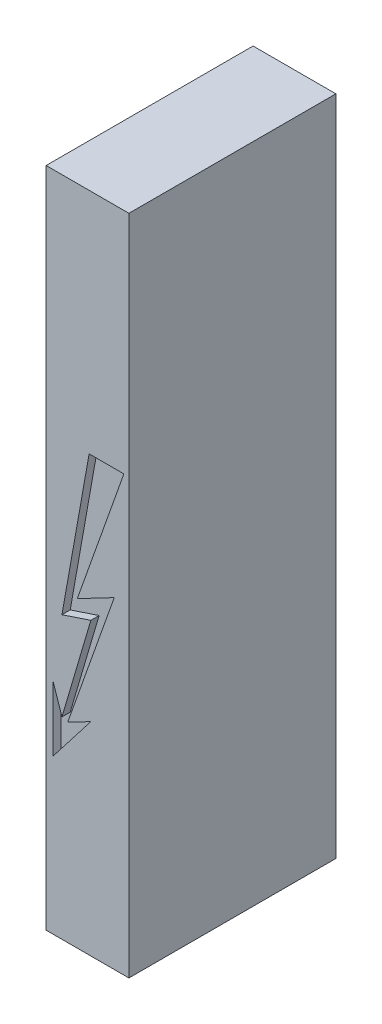
ISO-10303-21;
HEADER;
FILE_DESCRIPTION(('STEP AP214'),'2;1');
FILE_NAME('part.step','',(''),(''),'','','');
FILE_SCHEMA(('AUTOMOTIVE_DESIGN { 1 0 10303 214 1 1 1 1 }'));
ENDSEC;
DATA;
#1=APPLICATION_CONTEXT('core data for automotive mechanical design processes');
#2=APPLICATION_PROTOCOL_DEFINITION('international standard','automotive_design',2000,#1);
#3=PRODUCT_CONTEXT('',#1,'mechanical');
#4=PRODUCT('Part','Part','',(#3));
#5=PRODUCT_RELATED_PRODUCT_CATEGORY('part','',(#4));
#6=PRODUCT_DEFINITION_FORMATION('','',#4);
#7=PRODUCT_DEFINITION_CONTEXT('part definition',#1,'design');
#8=PRODUCT_DEFINITION('design','',#6,#7);
#9=PRODUCT_DEFINITION_SHAPE('','',#8);
#10=(LENGTH_UNIT() NAMED_UNIT(*) SI_UNIT(.MILLI.,.METRE.));
#11=(NAMED_UNIT(*) PLANE_ANGLE_UNIT() SI_UNIT($,.RADIAN.));
#12=(NAMED_UNIT(*) SI_UNIT($,.STERADIAN.) SOLID_ANGLE_UNIT());
#13=UNCERTAINTY_MEASURE_WITH_UNIT(LENGTH_MEASURE(1.E-05),#10,'distance_accuracy_value','');
#14=(GEOMETRIC_REPRESENTATION_CONTEXT(3) GLOBAL_UNCERTAINTY_ASSIGNED_CONTEXT((#13)) GLOBAL_UNIT_ASSIGNED_CONTEXT((#10,
#11,#12)) REPRESENTATION_CONTEXT('',''));
#15=CARTESIAN_POINT('',(0.,0.,0.));
#16=DIRECTION('',(0.,0.,1.));
#17=DIRECTION('',(1.,0.,0.));
#18=AXIS2_PLACEMENT_3D('',#15,#16,#17);
#19=CARTESIAN_POINT('',(-5.,-40.,12.5));
#20=DIRECTION('',(1.,0.,0.));
#21=DIRECTION('',(0.,0.,-1.));
#22=AXIS2_PLACEMENT_3D('',#19,#20,#21);
#23=PLANE('',#22);
#24=DIRECTION('',(0.,-1.,0.));
#25=VECTOR('',#24,1.);
#26=CARTESIAN_POINT('',(-5.,-40.,-12.5));
#27=LINE('',#26,#25);
#28=CARTESIAN_POINT('',(-5.,40.,-12.5));
#29=VERTEX_POINT('',#28);
#30=CARTESIAN_POINT('',(-5.,-40.,-12.5));
#31=VERTEX_POINT('',#30);
#32=EDGE_CURVE('E228',#29,#31,#27,.T.);
#33=ORIENTED_EDGE('',*,*,#32,.T.);
#34=DIRECTION('',(0.,0.,-1.));
#35=VECTOR('',#34,1.);
#36=CARTESIAN_POINT('',(-5.,-40.,12.5));
#37=LINE('',#36,#35);
#38=CARTESIAN_POINT('',(-5.,-40.,12.5));
#39=VERTEX_POINT('',#38);
#40=EDGE_CURVE('E11',#39,#31,#37,.T.);
#41=ORIENTED_EDGE('',*,*,#40,.F.);
#42=DIRECTION('',(0.,-1.,0.));
#43=VECTOR('',#42,1.);
#44=CARTESIAN_POINT('',(-5.,-40.,12.5));
#45=LINE('',#44,#43);
#46=CARTESIAN_POINT('',(-5.,40.,12.5));
#47=VERTEX_POINT('',#46);
#48=EDGE_CURVE('E246',#47,#39,#45,.T.);
#49=ORIENTED_EDGE('',*,*,#48,.F.);
#50=DIRECTION('',(0.,0.,-1.));
#51=VECTOR('',#50,1.);
#52=CARTESIAN_POINT('',(-5.,40.,12.5));
#53=LINE('',#52,#51);
#54=EDGE_CURVE('E252',#47,#29,#53,.T.);
#55=ORIENTED_EDGE('',*,*,#54,.T.);
#56=EDGE_LOOP('',(#33,#41,#49,#55));
#57=FACE_BOUND('',#56,.T.);
#58=ADVANCED_FACE('F36',(#57),#23,.F.);
#59=CARTESIAN_POINT('',(5.,-40.,12.5));
#60=DIRECTION('',(0.,1.,0.));
#61=DIRECTION('',(0.,0.,1.));
#62=AXIS2_PLACEMENT_3D('',#59,#60,#61);
#63=PLANE('',#62);
#64=DIRECTION('',(1.,0.,0.));
#65=VECTOR('',#64,1.);
#66=CARTESIAN_POINT('',(5.,-40.,-12.5));
#67=LINE('',#66,#65);
#68=CARTESIAN_POINT('',(5.,-40.,-12.5));
#69=VERTEX_POINT('',#68);
#70=EDGE_CURVE('E255',#31,#69,#67,.T.);
#71=ORIENTED_EDGE('',*,*,#70,.T.);
#72=DIRECTION('',(0.,0.,-1.));
#73=VECTOR('',#72,1.);
#74=CARTESIAN_POINT('',(5.,-40.,12.5));
#75=LINE('',#74,#73);
#76=CARTESIAN_POINT('',(5.,-40.,12.5));
#77=VERTEX_POINT('',#76);
#78=EDGE_CURVE('E43',#77,#69,#75,.T.);
#79=ORIENTED_EDGE('',*,*,#78,.F.);
#80=DIRECTION('',(1.,0.,0.));
#81=VECTOR('',#80,1.);
#82=CARTESIAN_POINT('',(5.,-40.,12.5));
#83=LINE('',#82,#81);
#84=EDGE_CURVE('E87',#39,#77,#83,.T.);
#85=ORIENTED_EDGE('',*,*,#84,.F.);
#86=ORIENTED_EDGE('',*,*,#40,.T.);
#87=EDGE_LOOP('',(#71,#79,#85,#86));
#88=FACE_BOUND('',#87,.T.);
#89=ADVANCED_FACE('F284',(#88),#63,.F.);
#90=CARTESIAN_POINT('',(5.,-40.,12.5));
#91=DIRECTION('',(-1.,0.,0.));
#92=DIRECTION('',(0.,0.,1.));
#93=AXIS2_PLACEMENT_3D('',#90,#91,#92);
#94=PLANE('',#93);
#95=DIRECTION('',(0.,1.,0.));
#96=VECTOR('',#95,1.);
#97=CARTESIAN_POINT('',(5.,-40.,-12.5));
#98=LINE('',#97,#96);
#99=CARTESIAN_POINT('',(5.,40.,-12.5));
#100=VERTEX_POINT('',#99);
#101=EDGE_CURVE('E257',#69,#100,#98,.T.);
#102=ORIENTED_EDGE('',*,*,#101,.T.);
#103=DIRECTION('',(0.,0.,-1.));
#104=VECTOR('',#103,1.);
#105=CARTESIAN_POINT('',(5.,40.,12.5));
#106=LINE('',#105,#104);
#107=CARTESIAN_POINT('',(5.,40.,12.5));
#108=VERTEX_POINT('',#107);
#109=EDGE_CURVE('E261',#108,#100,#106,.T.);
#110=ORIENTED_EDGE('',*,*,#109,.F.);
#111=DIRECTION('',(0.,1.,0.));
#112=VECTOR('',#111,1.);
#113=CARTESIAN_POINT('',(5.,-40.,12.5));
#114=LINE('',#113,#112);
#115=EDGE_CURVE('E249',#77,#108,#114,.T.);
#116=ORIENTED_EDGE('',*,*,#115,.F.);
#117=ORIENTED_EDGE('',*,*,#78,.T.);
#118=EDGE_LOOP('',(#102,#110,#116,#117));
#119=FACE_BOUND('',#118,.T.);
#120=ADVANCED_FACE('F266',(#119),#94,.F.);
#121=CARTESIAN_POINT('',(5.,40.,12.5));
#122=DIRECTION('',(0.,-1.,0.));
#123=DIRECTION('',(1.,0.,0.));
#124=AXIS2_PLACEMENT_3D('',#121,#122,#123);
#125=PLANE('',#124);
#126=DIRECTION('',(-1.,0.,0.));
#127=VECTOR('',#126,1.);
#128=CARTESIAN_POINT('',(5.,40.,-12.5));
#129=LINE('',#128,#127);
#130=EDGE_CURVE('E80',#100,#29,#129,.T.);
#131=ORIENTED_EDGE('',*,*,#130,.T.);
#132=ORIENTED_EDGE('',*,*,#54,.F.);
#133=DIRECTION('',(-1.,0.,0.));
#134=VECTOR('',#133,1.);
#135=CARTESIAN_POINT('',(5.,40.,12.5));
#136=LINE('',#135,#134);
#137=EDGE_CURVE('E59',#108,#47,#136,.T.);
#138=ORIENTED_EDGE('',*,*,#137,.F.);
#139=ORIENTED_EDGE('',*,*,#109,.T.);
#140=EDGE_LOOP('',(#131,#132,#138,#139));
#141=FACE_BOUND('',#140,.T.);
#142=ADVANCED_FACE('F274',(#141),#125,.F.);
#143=CARTESIAN_POINT('',(0.,0.,12.5));
#144=DIRECTION('',(0.,0.,1.));
#145=DIRECTION('',(1.,0.,0.));
#146=AXIS2_PLACEMENT_3D('',#143,#144,#145);
#147=PLANE('',#146);
#148=DIRECTION('',(0.334377178520095,0.942439336235994,0.));
#149=VECTOR('',#148,1.);
#150=CARTESIAN_POINT('',(-1.23803225223413,-3.43125061005469,12.5));
#151=LINE('',#150,#149);
#152=CARTESIAN_POINT('',(-1.23803225223413,-3.43125061005469,12.5));
#153=VERTEX_POINT('',#152);
#154=CARTESIAN_POINT('',(4.38989294329531,12.4310104124686,12.5));
#155=VERTEX_POINT('',#154);
#156=EDGE_CURVE('E50',#153,#155,#151,.T.);
#157=ORIENTED_EDGE('',*,*,#156,.F.);
#158=DIRECTION('',(-0.885968643465612,-0.46374514854142,0.));
#159=VECTOR('',#158,1.);
#160=CARTESIAN_POINT('',(3.22694529873063,-1.09413440071942,12.5));
#161=LINE('',#160,#159);
#162=CARTESIAN_POINT('',(3.22694529873063,-1.09413440071942,12.5));
#163=VERTEX_POINT('',#162);
#164=EDGE_CURVE('E172',#163,#153,#161,.T.);
#165=ORIENTED_EDGE('',*,*,#164,.F.);
#166=DIRECTION('',(0.334377178520095,0.942439336235994,0.));
#167=VECTOR('',#166,1.);
#168=CARTESIAN_POINT('',(-2.395490823155,-16.9409245141803,12.5));
#169=LINE('',#168,#167);
#170=CARTESIAN_POINT('',(-2.395490823155,-16.9409245141803,12.5));
#171=VERTEX_POINT('',#170);
#172=EDGE_CURVE('E175',#171,#163,#169,.T.);
#173=ORIENTED_EDGE('',*,*,#172,.F.);
#174=DIRECTION('',(-0.885968643465612,-0.46374514854142,0.));
#175=VECTOR('',#174,1.);
#176=CARTESIAN_POINT('',(0.403107322714153,-15.4760461322692,12.5));
#177=LINE('',#176,#175);
#178=CARTESIAN_POINT('',(0.403107322714153,-15.4760461322692,12.5));
#179=VERTEX_POINT('',#178);
#180=EDGE_CURVE('E221',#179,#171,#177,.T.);
#181=ORIENTED_EDGE('',*,*,#180,.F.);
#182=DIRECTION('',(0.612303075014751,0.790623136726646,0.));
#183=VECTOR('',#182,1.);
#184=CARTESIAN_POINT('',(-4.19416945297008,-21.4121805942829,12.5));
#185=LINE('',#184,#183);
#186=CARTESIAN_POINT('',(-4.19416945297008,-21.4121805942829,12.5));
#187=VERTEX_POINT('',#186);
#188=EDGE_CURVE('E218',#187,#179,#185,.T.);
#189=ORIENTED_EDGE('',*,*,#188,.F.);
#190=DIRECTION('',(0.,-1.,0.));
#191=VECTOR('',#190,1.);
#192=CARTESIAN_POINT('',(-4.19416945297008,-13.4263047640388,12.5));
#193=LINE('',#192,#191);
#194=CARTESIAN_POINT('',(-4.19416945297008,-13.4263047640388,12.5));
#195=VERTEX_POINT('',#194);
#196=EDGE_CURVE('E215',#195,#187,#193,.T.);
#197=ORIENTED_EDGE('',*,*,#196,.F.);
#198=DIRECTION('',(-0.31622776601684,0.948683298050513,0.));
#199=VECTOR('',#198,1.);
#200=CARTESIAN_POINT('',(-3.09093177233658,-16.7360178059393,12.5));
#201=LINE('',#200,#199);
#202=CARTESIAN_POINT('',(-3.09093177233658,-16.7360178059393,12.5));
#203=VERTEX_POINT('',#202);
#204=EDGE_CURVE('E212',#203,#195,#201,.T.);
#205=ORIENTED_EDGE('',*,*,#204,.F.);
#206=DIRECTION('',(-0.282629976577567,-0.959229011414774,0.));
#207=VECTOR('',#206,1.);
#208=CARTESIAN_POINT('',(0.403107322713769,-4.87746087728354,12.5));
#209=LINE('',#208,#207);
#210=CARTESIAN_POINT('',(0.403107322713769,-4.87746087728354,12.5));
#211=VERTEX_POINT('',#210);
#212=EDGE_CURVE('E209',#211,#203,#209,.T.);
#213=ORIENTED_EDGE('',*,*,#212,.F.);
#214=DIRECTION('',(0.948683298050513,0.31622776601684,0.));
#215=VECTOR('',#214,1.);
#216=CARTESIAN_POINT('',(-3.09093177233659,-6.04214057563367,12.5));
#217=LINE('',#216,#215);
#218=CARTESIAN_POINT('',(-3.09093177233659,-6.04214057563367,12.5));
#219=VERTEX_POINT('',#218);
#220=EDGE_CURVE('E206',#219,#211,#217,.T.);
#221=ORIENTED_EDGE('',*,*,#220,.F.);
#222=DIRECTION('',(-0.175033334717494,-0.984562507785907,0.));
#223=VECTOR('',#222,1.);
#224=CARTESIAN_POINT('',(0.193183958881578,12.4310104124686,12.5));
#225=LINE('',#224,#223);
#226=CARTESIAN_POINT('',(0.193183958881578,12.4310104124686,12.5));
#227=VERTEX_POINT('',#226);
#228=EDGE_CURVE('E203',#227,#219,#225,.T.);
#229=ORIENTED_EDGE('',*,*,#228,.F.);
#230=DIRECTION('',(-1.,0.,0.));
#231=VECTOR('',#230,1.);
#232=CARTESIAN_POINT('',(4.38989294329531,12.4310104124686,12.5));
#233=LINE('',#232,#231);
#234=EDGE_CURVE('E201',#155,#227,#233,.T.);
#235=ORIENTED_EDGE('',*,*,#234,.F.);
#236=EDGE_LOOP('',(#157,#165,#173,#181,#189,#197,#205,#213,#221,#229,#235));
#237=FACE_BOUND('',#236,.T.);
#238=ORIENTED_EDGE('',*,*,#48,.T.);
#239=ORIENTED_EDGE('',*,*,#84,.T.);
#240=ORIENTED_EDGE('',*,*,#115,.T.);
#241=ORIENTED_EDGE('',*,*,#137,.T.);
#242=EDGE_LOOP('',(#238,#239,#240,#241));
#243=FACE_BOUND('',#242,.T.);
#244=ADVANCED_FACE('F276',(#237,#243),#147,.T.);
#245=CARTESIAN_POINT('',(0.,0.,-12.5));
#246=DIRECTION('',(0.,0.,1.));
#247=DIRECTION('',(1.,0.,0.));
#248=AXIS2_PLACEMENT_3D('',#245,#246,#247);
#249=PLANE('',#248);
#250=ORIENTED_EDGE('',*,*,#32,.F.);
#251=ORIENTED_EDGE('',*,*,#130,.F.);
#252=ORIENTED_EDGE('',*,*,#101,.F.);
#253=ORIENTED_EDGE('',*,*,#70,.F.);
#254=EDGE_LOOP('',(#250,#251,#252,#253));
#255=FACE_BOUND('',#254,.T.);
#256=ADVANCED_FACE('F270',(#255),#249,.F.);
#257=CARTESIAN_POINT('',(-1.23803225223413,-3.43125061005469,11.5));
#258=DIRECTION('',(0.942439336235994,-0.334377178520095,0.));
#259=DIRECTION('',(0.334377178520095,0.942439336235994,0.));
#260=AXIS2_PLACEMENT_3D('',#257,#258,#259);
#261=PLANE('',#260);
#262=ORIENTED_EDGE('',*,*,#156,.T.);
#263=DIRECTION('',(0.,0.,1.));
#264=VECTOR('',#263,1.);
#265=CARTESIAN_POINT('',(4.38989294329531,12.4310104124686,11.5));
#266=LINE('',#265,#264);
#267=CARTESIAN_POINT('',(4.38989294329531,12.4310104124686,11.5));
#268=VERTEX_POINT('',#267);
#269=EDGE_CURVE('E149',#268,#155,#266,.T.);
#270=ORIENTED_EDGE('',*,*,#269,.F.);
#271=DIRECTION('',(0.334377178520095,0.942439336235994,0.));
#272=VECTOR('',#271,1.);
#273=CARTESIAN_POINT('',(-1.23803225223413,-3.43125061005469,11.5));
#274=LINE('',#273,#272);
#275=CARTESIAN_POINT('',(-1.23803225223413,-3.43125061005469,11.5));
#276=VERTEX_POINT('',#275);
#277=EDGE_CURVE('E153',#276,#268,#274,.T.);
#278=ORIENTED_EDGE('',*,*,#277,.F.);
#279=DIRECTION('',(0.,0.,1.));
#280=VECTOR('',#279,1.);
#281=CARTESIAN_POINT('',(-1.23803225223413,-3.43125061005469,11.5));
#282=LINE('',#281,#280);
#283=EDGE_CURVE('E226',#276,#153,#282,.T.);
#284=ORIENTED_EDGE('',*,*,#283,.T.);
#285=EDGE_LOOP('',(#262,#270,#278,#284));
#286=FACE_BOUND('',#285,.T.);
#287=ADVANCED_FACE('F151',(#286),#261,.F.);
#288=CARTESIAN_POINT('',(3.22694529873063,-1.09413440071942,11.5));
#289=DIRECTION('',(-0.46374514854142,0.885968643465612,0.));
#290=DIRECTION('',(-0.885968643465612,-0.46374514854142,0.));
#291=AXIS2_PLACEMENT_3D('',#288,#289,#290);
#292=PLANE('',#291);
#293=ORIENTED_EDGE('',*,*,#164,.T.);
#294=ORIENTED_EDGE('',*,*,#283,.F.);
#295=DIRECTION('',(-0.885968643465612,-0.46374514854142,0.));
#296=VECTOR('',#295,1.);
#297=CARTESIAN_POINT('',(3.22694529873063,-1.09413440071942,11.5));
#298=LINE('',#297,#296);
#299=CARTESIAN_POINT('',(3.22694529873063,-1.09413440071942,11.5));
#300=VERTEX_POINT('',#299);
#301=EDGE_CURVE('E159',#300,#276,#298,.T.);
#302=ORIENTED_EDGE('',*,*,#301,.F.);
#303=DIRECTION('',(0.,0.,1.));
#304=VECTOR('',#303,1.);
#305=CARTESIAN_POINT('',(3.22694529873063,-1.09413440071942,11.5));
#306=LINE('',#305,#304);
#307=EDGE_CURVE('E229',#300,#163,#306,.T.);
#308=ORIENTED_EDGE('',*,*,#307,.T.);
#309=EDGE_LOOP('',(#293,#294,#302,#308));
#310=FACE_BOUND('',#309,.T.);
#311=ADVANCED_FACE('F323',(#310),#292,.F.);
#312=CARTESIAN_POINT('',(-2.395490823155,-16.9409245141803,11.5));
#313=DIRECTION('',(0.942439336235994,-0.334377178520095,0.));
#314=DIRECTION('',(0.334377178520095,0.942439336235994,0.));
#315=AXIS2_PLACEMENT_3D('',#312,#313,#314);
#316=PLANE('',#315);
#317=ORIENTED_EDGE('',*,*,#172,.T.);
#318=ORIENTED_EDGE('',*,*,#307,.F.);
#319=DIRECTION('',(0.334377178520095,0.942439336235994,0.));
#320=VECTOR('',#319,1.);
#321=CARTESIAN_POINT('',(-2.395490823155,-16.9409245141803,11.5));
#322=LINE('',#321,#320);
#323=CARTESIAN_POINT('',(-2.395490823155,-16.9409245141803,11.5));
#324=VERTEX_POINT('',#323);
#325=EDGE_CURVE('E197',#324,#300,#322,.T.);
#326=ORIENTED_EDGE('',*,*,#325,.F.);
#327=DIRECTION('',(0.,0.,1.));
#328=VECTOR('',#327,1.);
#329=CARTESIAN_POINT('',(-2.395490823155,-16.9409245141803,11.5));
#330=LINE('',#329,#328);
#331=EDGE_CURVE('E231',#324,#171,#330,.T.);
#332=ORIENTED_EDGE('',*,*,#331,.T.);
#333=EDGE_LOOP('',(#317,#318,#326,#332));
#334=FACE_BOUND('',#333,.T.);
#335=ADVANCED_FACE('F332',(#334),#316,.F.);
#336=CARTESIAN_POINT('',(0.403107322714153,-15.4760461322692,11.5));
#337=DIRECTION('',(-0.46374514854142,0.885968643465612,0.));
#338=DIRECTION('',(-0.885968643465612,-0.46374514854142,0.));
#339=AXIS2_PLACEMENT_3D('',#336,#337,#338);
#340=PLANE('',#339);
#341=ORIENTED_EDGE('',*,*,#180,.T.);
#342=ORIENTED_EDGE('',*,*,#331,.F.);
#343=DIRECTION('',(-0.885968643465612,-0.46374514854142,0.));
#344=VECTOR('',#343,1.);
#345=CARTESIAN_POINT('',(0.403107322714153,-15.4760461322692,11.5));
#346=LINE('',#345,#344);
#347=CARTESIAN_POINT('',(0.403107322714153,-15.4760461322692,11.5));
#348=VERTEX_POINT('',#347);
#349=EDGE_CURVE('E194',#348,#324,#346,.T.);
#350=ORIENTED_EDGE('',*,*,#349,.F.);
#351=DIRECTION('',(0.,0.,1.));
#352=VECTOR('',#351,1.);
#353=CARTESIAN_POINT('',(0.403107322714153,-15.4760461322692,11.5));
#354=LINE('',#353,#352);
#355=EDGE_CURVE('E233',#348,#179,#354,.T.);
#356=ORIENTED_EDGE('',*,*,#355,.T.);
#357=EDGE_LOOP('',(#341,#342,#350,#356));
#358=FACE_BOUND('',#357,.T.);
#359=ADVANCED_FACE('F342',(#358),#340,.F.);
#360=CARTESIAN_POINT('',(-4.19416945297008,-21.4121805942829,11.5));
#361=DIRECTION('',(0.790623136726646,-0.612303075014751,0.));
#362=DIRECTION('',(0.612303075014751,0.790623136726646,0.));
#363=AXIS2_PLACEMENT_3D('',#360,#361,#362);
#364=PLANE('',#363);
#365=ORIENTED_EDGE('',*,*,#188,.T.);
#366=ORIENTED_EDGE('',*,*,#355,.F.);
#367=DIRECTION('',(0.612303075014751,0.790623136726646,0.));
#368=VECTOR('',#367,1.);
#369=CARTESIAN_POINT('',(-4.19416945297008,-21.4121805942829,11.5));
#370=LINE('',#369,#368);
#371=CARTESIAN_POINT('',(-4.19416945297008,-21.4121805942829,11.5));
#372=VERTEX_POINT('',#371);
#373=EDGE_CURVE('E191',#372,#348,#370,.T.);
#374=ORIENTED_EDGE('',*,*,#373,.F.);
#375=DIRECTION('',(0.,0.,1.));
#376=VECTOR('',#375,1.);
#377=CARTESIAN_POINT('',(-4.19416945297008,-21.4121805942829,11.5));
#378=LINE('',#377,#376);
#379=EDGE_CURVE('E235',#372,#187,#378,.T.);
#380=ORIENTED_EDGE('',*,*,#379,.T.);
#381=EDGE_LOOP('',(#365,#366,#374,#380));
#382=FACE_BOUND('',#381,.T.);
#383=ADVANCED_FACE('F352',(#382),#364,.F.);
#384=CARTESIAN_POINT('',(-4.19416945297008,-13.4263047640388,11.5));
#385=DIRECTION('',(-1.,0.,0.));
#386=DIRECTION('',(0.,-1.,0.));
#387=AXIS2_PLACEMENT_3D('',#384,#385,#386);
#388=PLANE('',#387);
#389=ORIENTED_EDGE('',*,*,#196,.T.);
#390=ORIENTED_EDGE('',*,*,#379,.F.);
#391=DIRECTION('',(0.,-1.,0.));
#392=VECTOR('',#391,1.);
#393=CARTESIAN_POINT('',(-4.19416945297008,-13.4263047640388,11.5));
#394=LINE('',#393,#392);
#395=CARTESIAN_POINT('',(-4.19416945297008,-13.4263047640388,11.5));
#396=VERTEX_POINT('',#395);
#397=EDGE_CURVE('E188',#396,#372,#394,.T.);
#398=ORIENTED_EDGE('',*,*,#397,.F.);
#399=DIRECTION('',(0.,0.,1.));
#400=VECTOR('',#399,1.);
#401=CARTESIAN_POINT('',(-4.19416945297008,-13.4263047640388,11.5));
#402=LINE('',#401,#400);
#403=EDGE_CURVE('E237',#396,#195,#402,.T.);
#404=ORIENTED_EDGE('',*,*,#403,.T.);
#405=EDGE_LOOP('',(#389,#390,#398,#404));
#406=FACE_BOUND('',#405,.T.);
#407=ADVANCED_FACE('F362',(#406),#388,.F.);
#408=CARTESIAN_POINT('',(-3.09093177233658,-16.7360178059393,11.5));
#409=DIRECTION('',(0.948683298050513,0.31622776601684,0.));
#410=DIRECTION('',(-0.31622776601684,0.948683298050513,0.));
#411=AXIS2_PLACEMENT_3D('',#408,#409,#410);
#412=PLANE('',#411);
#413=ORIENTED_EDGE('',*,*,#204,.T.);
#414=ORIENTED_EDGE('',*,*,#403,.F.);
#415=DIRECTION('',(-0.31622776601684,0.948683298050513,0.));
#416=VECTOR('',#415,1.);
#417=CARTESIAN_POINT('',(-3.09093177233658,-16.7360178059393,11.5));
#418=LINE('',#417,#416);
#419=CARTESIAN_POINT('',(-3.09093177233658,-16.7360178059393,11.5));
#420=VERTEX_POINT('',#419);
#421=EDGE_CURVE('E185',#420,#396,#418,.T.);
#422=ORIENTED_EDGE('',*,*,#421,.F.);
#423=DIRECTION('',(0.,0.,1.));
#424=VECTOR('',#423,1.);
#425=CARTESIAN_POINT('',(-3.09093177233658,-16.7360178059393,11.5));
#426=LINE('',#425,#424);
#427=EDGE_CURVE('E239',#420,#203,#426,.T.);
#428=ORIENTED_EDGE('',*,*,#427,.T.);
#429=EDGE_LOOP('',(#413,#414,#422,#428));
#430=FACE_BOUND('',#429,.T.);
#431=ADVANCED_FACE('F372',(#430),#412,.F.);
#432=CARTESIAN_POINT('',(0.403107322713769,-4.87746087728354,11.5));
#433=DIRECTION('',(-0.959229011414774,0.282629976577567,0.));
#434=DIRECTION('',(-0.282629976577567,-0.959229011414774,0.));
#435=AXIS2_PLACEMENT_3D('',#432,#433,#434);
#436=PLANE('',#435);
#437=ORIENTED_EDGE('',*,*,#212,.T.);
#438=ORIENTED_EDGE('',*,*,#427,.F.);
#439=DIRECTION('',(-0.282629976577567,-0.959229011414774,0.));
#440=VECTOR('',#439,1.);
#441=CARTESIAN_POINT('',(0.403107322713769,-4.87746087728354,11.5));
#442=LINE('',#441,#440);
#443=CARTESIAN_POINT('',(0.403107322713769,-4.87746087728354,11.5));
#444=VERTEX_POINT('',#443);
#445=EDGE_CURVE('E182',#444,#420,#442,.T.);
#446=ORIENTED_EDGE('',*,*,#445,.F.);
#447=DIRECTION('',(0.,0.,1.));
#448=VECTOR('',#447,1.);
#449=CARTESIAN_POINT('',(0.403107322713769,-4.87746087728354,11.5));
#450=LINE('',#449,#448);
#451=EDGE_CURVE('E241',#444,#211,#450,.T.);
#452=ORIENTED_EDGE('',*,*,#451,.T.);
#453=EDGE_LOOP('',(#437,#438,#446,#452));
#454=FACE_BOUND('',#453,.T.);
#455=ADVANCED_FACE('F382',(#454),#436,.F.);
#456=CARTESIAN_POINT('',(-3.09093177233659,-6.04214057563367,11.5));
#457=DIRECTION('',(0.31622776601684,-0.948683298050513,0.));
#458=DIRECTION('',(0.948683298050513,0.31622776601684,0.));
#459=AXIS2_PLACEMENT_3D('',#456,#457,#458);
#460=PLANE('',#459);
#461=ORIENTED_EDGE('',*,*,#220,.T.);
#462=ORIENTED_EDGE('',*,*,#451,.F.);
#463=DIRECTION('',(0.948683298050513,0.31622776601684,0.));
#464=VECTOR('',#463,1.);
#465=CARTESIAN_POINT('',(-3.09093177233659,-6.04214057563367,11.5));
#466=LINE('',#465,#464);
#467=CARTESIAN_POINT('',(-3.09093177233659,-6.04214057563367,11.5));
#468=VERTEX_POINT('',#467);
#469=EDGE_CURVE('E179',#468,#444,#466,.T.);
#470=ORIENTED_EDGE('',*,*,#469,.F.);
#471=DIRECTION('',(0.,0.,1.));
#472=VECTOR('',#471,1.);
#473=CARTESIAN_POINT('',(-3.09093177233659,-6.04214057563367,11.5));
#474=LINE('',#473,#472);
#475=EDGE_CURVE('E243',#468,#219,#474,.T.);
#476=ORIENTED_EDGE('',*,*,#475,.T.);
#477=EDGE_LOOP('',(#461,#462,#470,#476));
#478=FACE_BOUND('',#477,.T.);
#479=ADVANCED_FACE('F392',(#478),#460,.F.);
#480=CARTESIAN_POINT('',(0.193183958881578,12.4310104124686,11.5));
#481=DIRECTION('',(-0.984562507785907,0.175033334717494,0.));
#482=DIRECTION('',(-0.175033334717494,-0.984562507785907,0.));
#483=AXIS2_PLACEMENT_3D('',#480,#481,#482);
#484=PLANE('',#483);
#485=ORIENTED_EDGE('',*,*,#228,.T.);
#486=ORIENTED_EDGE('',*,*,#475,.F.);
#487=DIRECTION('',(-0.175033334717494,-0.984562507785907,0.));
#488=VECTOR('',#487,1.);
#489=CARTESIAN_POINT('',(0.193183958881578,12.4310104124686,11.5));
#490=LINE('',#489,#488);
#491=CARTESIAN_POINT('',(0.193183958881578,12.4310104124686,11.5));
#492=VERTEX_POINT('',#491);
#493=EDGE_CURVE('E167',#492,#468,#490,.T.);
#494=ORIENTED_EDGE('',*,*,#493,.F.);
#495=DIRECTION('',(0.,0.,1.));
#496=VECTOR('',#495,1.);
#497=CARTESIAN_POINT('',(0.193183958881578,12.4310104124686,11.5));
#498=LINE('',#497,#496);
#499=EDGE_CURVE('E158',#492,#227,#498,.T.);
#500=ORIENTED_EDGE('',*,*,#499,.T.);
#501=EDGE_LOOP('',(#485,#486,#494,#500));
#502=FACE_BOUND('',#501,.T.);
#503=ADVANCED_FACE('F402',(#502),#484,.F.);
#504=CARTESIAN_POINT('',(4.38989294329531,12.4310104124686,11.5));
#505=DIRECTION('',(0.,1.,0.));
#506=DIRECTION('',(0.,0.,1.));
#507=AXIS2_PLACEMENT_3D('',#504,#505,#506);
#508=PLANE('',#507);
#509=ORIENTED_EDGE('',*,*,#234,.T.);
#510=ORIENTED_EDGE('',*,*,#499,.F.);
#511=DIRECTION('',(-1.,0.,0.));
#512=VECTOR('',#511,1.);
#513=CARTESIAN_POINT('',(4.38989294329531,12.4310104124686,11.5));
#514=LINE('',#513,#512);
#515=EDGE_CURVE('E162',#268,#492,#514,.T.);
#516=ORIENTED_EDGE('',*,*,#515,.F.);
#517=ORIENTED_EDGE('',*,*,#269,.T.);
#518=EDGE_LOOP('',(#509,#510,#516,#517));
#519=FACE_BOUND('',#518,.T.);
#520=ADVANCED_FACE('F163',(#519),#508,.F.);
#521=CARTESIAN_POINT('',(0.,0.,11.5));
#522=DIRECTION('',(0.,0.,1.));
#523=DIRECTION('',(1.,0.,0.));
#524=AXIS2_PLACEMENT_3D('',#521,#522,#523);
#525=PLANE('',#524);
#526=ORIENTED_EDGE('',*,*,#277,.T.);
#527=ORIENTED_EDGE('',*,*,#515,.T.);
#528=ORIENTED_EDGE('',*,*,#493,.T.);
#529=ORIENTED_EDGE('',*,*,#469,.T.);
#530=ORIENTED_EDGE('',*,*,#445,.T.);
#531=ORIENTED_EDGE('',*,*,#421,.T.);
#532=ORIENTED_EDGE('',*,*,#397,.T.);
#533=ORIENTED_EDGE('',*,*,#373,.T.);
#534=ORIENTED_EDGE('',*,*,#349,.T.);
#535=ORIENTED_EDGE('',*,*,#325,.T.);
#536=ORIENTED_EDGE('',*,*,#301,.T.);
#537=EDGE_LOOP('',(#526,#527,#528,#529,#530,#531,#532,#533,#534,#535,#536));
#538=FACE_BOUND('',#537,.T.);
#539=ADVANCED_FACE('F169',(#538),#525,.T.);
#540=CLOSED_SHELL('',(#58,#89,#120,#142,#244,#256,#287,#311,#335,#359,#383,#407,#431,#455,#479,
#503,#520,#539));
#541=MANIFOLD_SOLID_BREP('B2',#540);
#542=ADVANCED_BREP_SHAPE_REPRESENTATION('',(#18,#541),#14);
#543=SHAPE_DEFINITION_REPRESENTATION(#9,#542);
ENDSEC;
END-ISO-10303-21;
